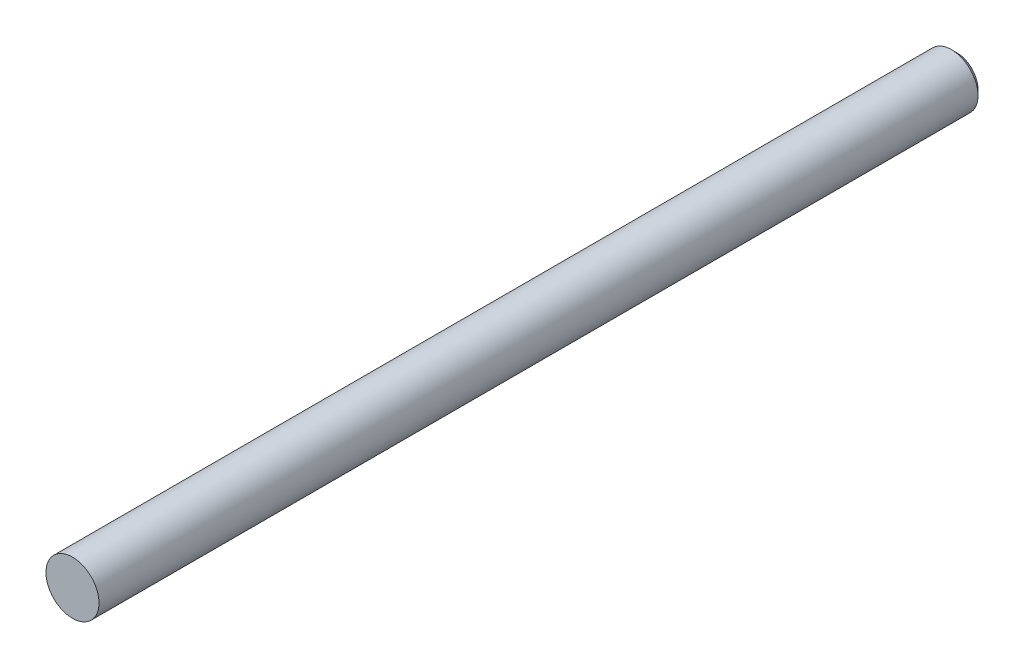
ISO-10303-21;
HEADER;
FILE_DESCRIPTION(('STEP AP214'),'2;1');
FILE_NAME('part.step','',(''),(''),'','','');
FILE_SCHEMA(('AUTOMOTIVE_DESIGN { 1 0 10303 214 1 1 1 1 }'));
ENDSEC;
DATA;
#1=APPLICATION_CONTEXT('core data for automotive mechanical design processes');
#2=APPLICATION_PROTOCOL_DEFINITION('international standard','automotive_design',2000,#1);
#3=PRODUCT_CONTEXT('',#1,'mechanical');
#4=PRODUCT('Part','Part','',(#3));
#5=PRODUCT_RELATED_PRODUCT_CATEGORY('part','',(#4));
#6=PRODUCT_DEFINITION_FORMATION('','',#4);
#7=PRODUCT_DEFINITION_CONTEXT('part definition',#1,'design');
#8=PRODUCT_DEFINITION('design','',#6,#7);
#9=PRODUCT_DEFINITION_SHAPE('','',#8);
#10=(LENGTH_UNIT() NAMED_UNIT(*) SI_UNIT(.MILLI.,.METRE.));
#11=(NAMED_UNIT(*) PLANE_ANGLE_UNIT() SI_UNIT($,.RADIAN.));
#12=(NAMED_UNIT(*) SI_UNIT($,.STERADIAN.) SOLID_ANGLE_UNIT());
#13=UNCERTAINTY_MEASURE_WITH_UNIT(LENGTH_MEASURE(1.E-05),#10,'distance_accuracy_value','');
#14=(GEOMETRIC_REPRESENTATION_CONTEXT(3) GLOBAL_UNCERTAINTY_ASSIGNED_CONTEXT((#13)) GLOBAL_UNIT_ASSIGNED_CONTEXT((#10,
#11,#12)) REPRESENTATION_CONTEXT('',''));
#15=CARTESIAN_POINT('',(0.,0.,0.));
#16=DIRECTION('',(0.,0.,1.));
#17=DIRECTION('',(1.,0.,0.));
#18=AXIS2_PLACEMENT_3D('',#15,#16,#17);
#19=CARTESIAN_POINT('',(0.,0.,100.));
#20=DIRECTION('',(0.,0.,-1.));
#21=DIRECTION('',(-1.,0.,0.));
#22=AXIS2_PLACEMENT_3D('',#19,#20,#21);
#23=CYLINDRICAL_SURFACE('',#22,3.);
#24=CARTESIAN_POINT('',(0.,0.,-99.4));
#25=DIRECTION('',(0.,0.,1.));
#26=DIRECTION('',(1.,0.,0.));
#27=AXIS2_PLACEMENT_3D('',#24,#25,#26);
#28=CIRCLE('',#27,3.);
#29=CARTESIAN_POINT('',(3.,0.,-99.4));
#30=VERTEX_POINT('',#29);
#31=EDGE_CURVE('E46',#30,#30,#28,.T.);
#32=ORIENTED_EDGE('',*,*,#31,.T.);
#33=EDGE_LOOP('',(#32));
#34=FACE_BOUND('',#33,.T.);
#35=CARTESIAN_POINT('',(0.,0.,0.));
#36=DIRECTION('',(0.,0.,1.));
#37=DIRECTION('',(1.,0.,0.));
#38=AXIS2_PLACEMENT_3D('',#35,#36,#37);
#39=CIRCLE('',#38,3.);
#40=CARTESIAN_POINT('',(3.,0.,0.));
#41=VERTEX_POINT('',#40);
#42=EDGE_CURVE('E41',#41,#41,#39,.T.);
#43=ORIENTED_EDGE('',*,*,#42,.F.);
#44=EDGE_LOOP('',(#43));
#45=FACE_BOUND('',#44,.T.);
#46=ADVANCED_FACE('F37',(#34,#45),#23,.T.);
#47=CARTESIAN_POINT('',(0.,0.,-100.));
#48=DIRECTION('',(0.,0.,1.));
#49=DIRECTION('',(1.,0.,0.));
#50=AXIS2_PLACEMENT_3D('',#47,#48,#49);
#51=PLANE('',#50);
#52=CARTESIAN_POINT('',(0.,0.,-100.));
#53=DIRECTION('',(0.,0.,1.));
#54=DIRECTION('',(1.,0.,0.));
#55=AXIS2_PLACEMENT_3D('',#52,#53,#54);
#56=CIRCLE('',#55,2.39999999999996);
#57=CARTESIAN_POINT('',(2.39999999999996,0.,-100.));
#58=VERTEX_POINT('',#57);
#59=EDGE_CURVE('E10',#58,#58,#56,.F.);
#60=ORIENTED_EDGE('',*,*,#59,.T.);
#61=EDGE_LOOP('',(#60));
#62=FACE_BOUND('',#61,.T.);
#63=ADVANCED_FACE('F61',(#62),#51,.F.);
#64=CARTESIAN_POINT('',(0.,0.,-99.4));
#65=DIRECTION('',(0.,0.,1.));
#66=DIRECTION('',(1.,0.,0.));
#67=AXIS2_PLACEMENT_3D('',#64,#65,#66);
#68=CONICAL_SURFACE('',#67,3.,0.785398163397468);
#69=ORIENTED_EDGE('',*,*,#59,.F.);
#70=EDGE_LOOP('',(#69));
#71=FACE_BOUND('',#70,.T.);
#72=ORIENTED_EDGE('',*,*,#31,.F.);
#73=EDGE_LOOP('',(#72));
#74=FACE_BOUND('',#73,.T.);
#75=ADVANCED_FACE('F39',(#71,#74),#68,.T.);
#76=CARTESIAN_POINT('',(0.,0.,0.));
#77=DIRECTION('',(0.,0.,1.));
#78=DIRECTION('',(1.,0.,0.));
#79=AXIS2_PLACEMENT_3D('',#76,#77,#78);
#80=PLANE('',#79);
#81=ORIENTED_EDGE('',*,*,#42,.T.);
#82=EDGE_LOOP('',(#81));
#83=FACE_BOUND('',#82,.T.);
#84=ADVANCED_FACE('F58',(#83),#80,.T.);
#85=CLOSED_SHELL('',(#46,#63,#75,#84));
#86=MANIFOLD_SOLID_BREP('B2',#85);
#87=ADVANCED_BREP_SHAPE_REPRESENTATION('',(#18,#86),#14);
#88=SHAPE_DEFINITION_REPRESENTATION(#9,#87);
ENDSEC;
END-ISO-10303-21;
